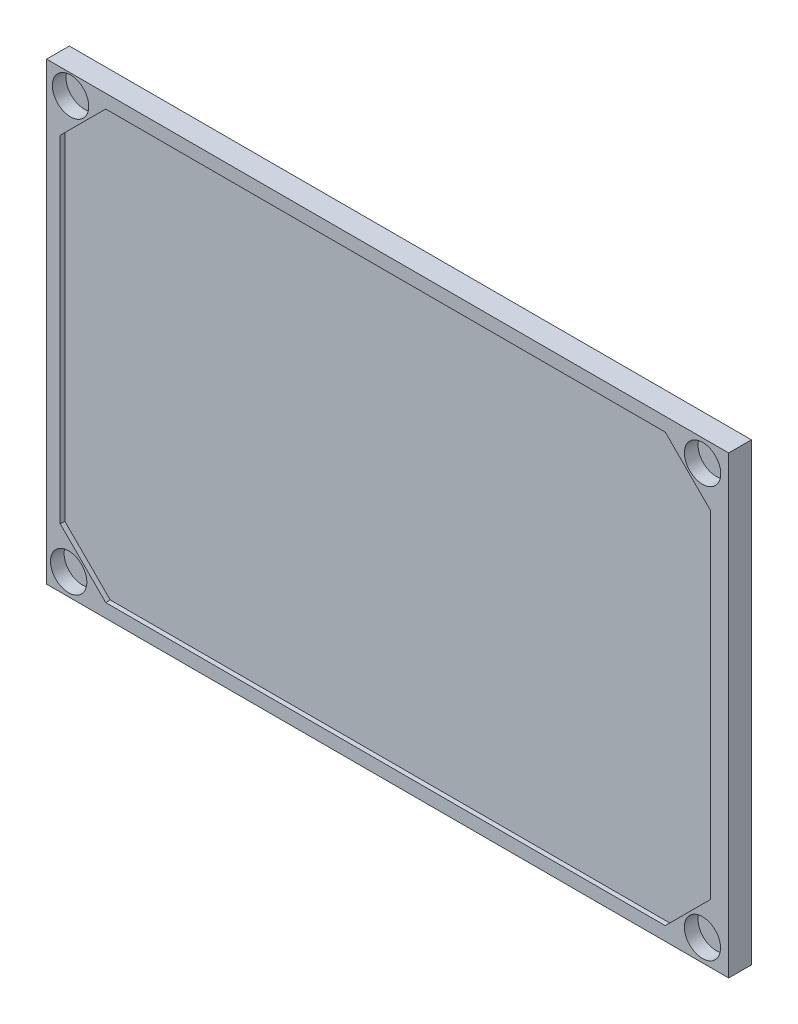
ISO-10303-21;
HEADER;
FILE_DESCRIPTION(('STEP AP214'),'2;1');
FILE_NAME('part.step','',(''),(''),'','','');
FILE_SCHEMA(('AUTOMOTIVE_DESIGN { 1 0 10303 214 1 1 1 1 }'));
ENDSEC;
DATA;
#1=APPLICATION_CONTEXT('core data for automotive mechanical design processes');
#2=APPLICATION_PROTOCOL_DEFINITION('international standard','automotive_design',2000,#1);
#3=PRODUCT_CONTEXT('',#1,'mechanical');
#4=PRODUCT('Part','Part','',(#3));
#5=PRODUCT_RELATED_PRODUCT_CATEGORY('part','',(#4));
#6=PRODUCT_DEFINITION_FORMATION('','',#4);
#7=PRODUCT_DEFINITION_CONTEXT('part definition',#1,'design');
#8=PRODUCT_DEFINITION('design','',#6,#7);
#9=PRODUCT_DEFINITION_SHAPE('','',#8);
#10=(LENGTH_UNIT() NAMED_UNIT(*) SI_UNIT(.MILLI.,.METRE.));
#11=(NAMED_UNIT(*) PLANE_ANGLE_UNIT() SI_UNIT($,.RADIAN.));
#12=(NAMED_UNIT(*) SI_UNIT($,.STERADIAN.) SOLID_ANGLE_UNIT());
#13=UNCERTAINTY_MEASURE_WITH_UNIT(LENGTH_MEASURE(1.E-05),#10,'distance_accuracy_value','');
#14=(GEOMETRIC_REPRESENTATION_CONTEXT(3) GLOBAL_UNCERTAINTY_ASSIGNED_CONTEXT((#13)) GLOBAL_UNIT_ASSIGNED_CONTEXT((#10,
#11,#12)) REPRESENTATION_CONTEXT('',''));
#15=CARTESIAN_POINT('',(0.,0.,0.));
#16=DIRECTION('',(0.,0.,1.));
#17=DIRECTION('',(1.,0.,0.));
#18=AXIS2_PLACEMENT_3D('',#15,#16,#17);
#19=CARTESIAN_POINT('',(-96.1737310095714,39.2273402674591,4.99999999999999));
#20=DIRECTION('',(1.,0.,0.));
#21=DIRECTION('',(0.,1.,0.));
#22=AXIS2_PLACEMENT_3D('',#19,#20,#21);
#23=PLANE('',#22);
#24=DIRECTION('',(0.,-1.,0.));
#25=VECTOR('',#24,1.);
#26=CARTESIAN_POINT('',(-96.1737310095714,39.2273402674591,0.));
#27=LINE('',#26,#25);
#28=CARTESIAN_POINT('',(-96.1737310095714,39.2273402674591,0.));
#29=VERTEX_POINT('',#28);
#30=CARTESIAN_POINT('',(-96.1737310095713,-60.7726597325409,0.));
#31=VERTEX_POINT('',#30);
#32=EDGE_CURVE('E202',#29,#31,#27,.T.);
#33=ORIENTED_EDGE('',*,*,#32,.T.);
#34=DIRECTION('',(0.,0.,-1.));
#35=VECTOR('',#34,1.);
#36=CARTESIAN_POINT('',(-96.1737310095713,-60.7726597325409,4.99999999999999));
#37=LINE('',#36,#35);
#38=CARTESIAN_POINT('',(-96.1737310095713,-60.7726597325409,4.99999999999999));
#39=VERTEX_POINT('',#38);
#40=EDGE_CURVE('E11',#39,#31,#37,.T.);
#41=ORIENTED_EDGE('',*,*,#40,.F.);
#42=DIRECTION('',(0.,-1.,0.));
#43=VECTOR('',#42,1.);
#44=CARTESIAN_POINT('',(-96.1737310095714,39.2273402674591,4.99999999999999));
#45=LINE('',#44,#43);
#46=CARTESIAN_POINT('',(-96.1737310095714,39.2273402674591,4.99999999999999));
#47=VERTEX_POINT('',#46);
#48=EDGE_CURVE('E214',#47,#39,#45,.T.);
#49=ORIENTED_EDGE('',*,*,#48,.F.);
#50=DIRECTION('',(0.,0.,-1.));
#51=VECTOR('',#50,1.);
#52=CARTESIAN_POINT('',(-96.1737310095714,39.2273402674591,4.99999999999999));
#53=LINE('',#52,#51);
#54=EDGE_CURVE('E220',#47,#29,#53,.T.);
#55=ORIENTED_EDGE('',*,*,#54,.T.);
#56=EDGE_LOOP('',(#33,#41,#49,#55));
#57=FACE_BOUND('',#56,.T.);
#58=ADVANCED_FACE('F42',(#57),#23,.F.);
#59=CARTESIAN_POINT('',(-96.1737310095713,-60.7726597325409,4.99999999999999));
#60=DIRECTION('',(0.,1.,0.));
#61=DIRECTION('',(0.,0.,1.));
#62=AXIS2_PLACEMENT_3D('',#59,#60,#61);
#63=PLANE('',#62);
#64=DIRECTION('',(1.,0.,0.));
#65=VECTOR('',#64,1.);
#66=CARTESIAN_POINT('',(-96.1737310095713,-60.7726597325409,0.));
#67=LINE('',#66,#65);
#68=CARTESIAN_POINT('',(53.8262689904287,-60.7726597325409,0.));
#69=VERTEX_POINT('',#68);
#70=EDGE_CURVE('E223',#31,#69,#67,.T.);
#71=ORIENTED_EDGE('',*,*,#70,.T.);
#72=DIRECTION('',(0.,0.,-1.));
#73=VECTOR('',#72,1.);
#74=CARTESIAN_POINT('',(53.8262689904287,-60.7726597325409,4.99999999999999));
#75=LINE('',#74,#73);
#76=CARTESIAN_POINT('',(53.8262689904287,-60.7726597325409,4.99999999999999));
#77=VERTEX_POINT('',#76);
#78=EDGE_CURVE('E49',#77,#69,#75,.T.);
#79=ORIENTED_EDGE('',*,*,#78,.F.);
#80=DIRECTION('',(1.,0.,0.));
#81=VECTOR('',#80,1.);
#82=CARTESIAN_POINT('',(-96.1737310095713,-60.7726597325409,4.99999999999999));
#83=LINE('',#82,#81);
#84=EDGE_CURVE('E93',#39,#77,#83,.T.);
#85=ORIENTED_EDGE('',*,*,#84,.F.);
#86=ORIENTED_EDGE('',*,*,#40,.T.);
#87=EDGE_LOOP('',(#71,#79,#85,#86));
#88=FACE_BOUND('',#87,.T.);
#89=ADVANCED_FACE('F252',(#88),#63,.F.);
#90=CARTESIAN_POINT('',(53.8262689904286,39.2273402674591,4.99999999999999));
#91=DIRECTION('',(-1.,0.,0.));
#92=DIRECTION('',(0.,-1.,0.));
#93=AXIS2_PLACEMENT_3D('',#90,#91,#92);
#94=PLANE('',#93);
#95=DIRECTION('',(0.,1.,0.));
#96=VECTOR('',#95,1.);
#97=CARTESIAN_POINT('',(53.8262689904286,39.2273402674591,0.));
#98=LINE('',#97,#96);
#99=CARTESIAN_POINT('',(53.8262689904286,39.2273402674591,0.));
#100=VERTEX_POINT('',#99);
#101=EDGE_CURVE('E225',#69,#100,#98,.T.);
#102=ORIENTED_EDGE('',*,*,#101,.T.);
#103=DIRECTION('',(0.,0.,-1.));
#104=VECTOR('',#103,1.);
#105=CARTESIAN_POINT('',(53.8262689904286,39.2273402674591,4.99999999999999));
#106=LINE('',#105,#104);
#107=CARTESIAN_POINT('',(53.8262689904286,39.2273402674591,4.99999999999999));
#108=VERTEX_POINT('',#107);
#109=EDGE_CURVE('E229',#108,#100,#106,.T.);
#110=ORIENTED_EDGE('',*,*,#109,.F.);
#111=DIRECTION('',(0.,1.,0.));
#112=VECTOR('',#111,1.);
#113=CARTESIAN_POINT('',(53.8262689904286,39.2273402674591,4.99999999999999));
#114=LINE('',#113,#112);
#115=EDGE_CURVE('E217',#77,#108,#114,.T.);
#116=ORIENTED_EDGE('',*,*,#115,.F.);
#117=ORIENTED_EDGE('',*,*,#78,.T.);
#118=EDGE_LOOP('',(#102,#110,#116,#117));
#119=FACE_BOUND('',#118,.T.);
#120=ADVANCED_FACE('F234',(#119),#94,.F.);
#121=CARTESIAN_POINT('',(-96.1737310095714,39.2273402674591,4.99999999999999));
#122=DIRECTION('',(0.,-1.,0.));
#123=DIRECTION('',(0.,0.,-1.));
#124=AXIS2_PLACEMENT_3D('',#121,#122,#123);
#125=PLANE('',#124);
#126=DIRECTION('',(-1.,0.,0.));
#127=VECTOR('',#126,1.);
#128=CARTESIAN_POINT('',(-96.1737310095714,39.2273402674591,0.));
#129=LINE('',#128,#127);
#130=EDGE_CURVE('E86',#100,#29,#129,.T.);
#131=ORIENTED_EDGE('',*,*,#130,.T.);
#132=ORIENTED_EDGE('',*,*,#54,.F.);
#133=DIRECTION('',(-1.,0.,0.));
#134=VECTOR('',#133,1.);
#135=CARTESIAN_POINT('',(-96.1737310095714,39.2273402674591,4.99999999999999));
#136=LINE('',#135,#134);
#137=EDGE_CURVE('E65',#108,#47,#136,.T.);
#138=ORIENTED_EDGE('',*,*,#137,.F.);
#139=ORIENTED_EDGE('',*,*,#109,.T.);
#140=EDGE_LOOP('',(#131,#132,#138,#139));
#141=FACE_BOUND('',#140,.T.);
#142=ADVANCED_FACE('F242',(#141),#125,.F.);
#143=CARTESIAN_POINT('',(0.,0.,4.99999999999999));
#144=DIRECTION('',(0.,0.,1.));
#145=DIRECTION('',(1.,0.,0.));
#146=AXIS2_PLACEMENT_3D('',#143,#144,#145);
#147=PLANE('',#146);
#148=CARTESIAN_POINT('',(48.0630864837965,-55.9471856739253,4.99999999999999));
#149=DIRECTION('',(0.,0.,1.));
#150=DIRECTION('',(1.,0.,0.));
#151=AXIS2_PLACEMENT_3D('',#148,#149,#150);
#152=CIRCLE('',#151,3.98220429856953);
#153=CARTESIAN_POINT('',(52.045290782366,-55.9471856739253,4.99999999999999));
#154=VERTEX_POINT('',#153);
#155=EDGE_CURVE('E542',#154,#154,#152,.T.);
#156=ORIENTED_EDGE('',*,*,#155,.F.);
#157=EDGE_LOOP('',(#156));
#158=FACE_BOUND('',#157,.T.);
#159=CARTESIAN_POINT('',(-91.3230211241603,-55.9869827447535,4.99999999999999));
#160=DIRECTION('',(0.,0.,1.));
#161=DIRECTION('',(1.,0.,0.));
#162=AXIS2_PLACEMENT_3D('',#159,#160,#161);
#163=CIRCLE('',#162,4.00000000000001);
#164=CARTESIAN_POINT('',(-87.3230211241603,-55.9869827447535,4.99999999999999));
#165=VERTEX_POINT('',#164);
#166=EDGE_CURVE('E541',#165,#165,#163,.T.);
#167=ORIENTED_EDGE('',*,*,#166,.F.);
#168=EDGE_LOOP('',(#167));
#169=FACE_BOUND('',#168,.T.);
#170=CARTESIAN_POINT('',(48.0832777286675,34.3814469796302,4.99999999999999));
#171=DIRECTION('',(0.,0.,1.));
#172=DIRECTION('',(1.,0.,0.));
#173=AXIS2_PLACEMENT_3D('',#170,#171,#172);
#174=CIRCLE('',#173,4.00000000000001);
#175=CARTESIAN_POINT('',(52.0832777286675,34.3814469796302,4.99999999999999));
#176=VERTEX_POINT('',#175);
#177=EDGE_CURVE('E551',#176,#176,#174,.T.);
#178=ORIENTED_EDGE('',*,*,#177,.F.);
#179=EDGE_LOOP('',(#178));
#180=FACE_BOUND('',#179,.T.);
#181=CARTESIAN_POINT('',(-90.907387200853,34.8576410337563,4.99999999999999));
#182=DIRECTION('',(0.,0.,1.));
#183=DIRECTION('',(1.,0.,0.));
#184=AXIS2_PLACEMENT_3D('',#181,#182,#183);
#185=CIRCLE('',#184,4.00000000000001);
#186=CARTESIAN_POINT('',(-86.907387200853,34.8576410337563,4.99999999999999));
#187=VERTEX_POINT('',#186);
#188=EDGE_CURVE('E166',#187,#187,#185,.T.);
#189=ORIENTED_EDGE('',*,*,#188,.F.);
#190=EDGE_LOOP('',(#189));
#191=FACE_BOUND('',#190,.T.);
#192=DIRECTION('',(-0.707106781186547,-0.707106781186548,0.));
#193=VECTOR('',#192,1.);
#194=CARTESIAN_POINT('',(-83.1737310095714,36.2273402674591,4.99999999999999));
#195=LINE('',#194,#193);
#196=CARTESIAN_POINT('',(-83.1737310095714,36.2273402674591,4.99999999999999));
#197=VERTEX_POINT('',#196);
#198=CARTESIAN_POINT('',(-93.1737310095714,26.2273402674591,4.99999999999999));
#199=VERTEX_POINT('',#198);
#200=EDGE_CURVE('E56',#197,#199,#195,.T.);
#201=ORIENTED_EDGE('',*,*,#200,.F.);
#202=DIRECTION('',(-1.,0.,0.));
#203=VECTOR('',#202,1.);
#204=CARTESIAN_POINT('',(-83.1737310095714,36.2273402674591,4.99999999999999));
#205=LINE('',#204,#203);
#206=CARTESIAN_POINT('',(39.8736654704286,36.2273402674591,4.99999999999999));
#207=VERTEX_POINT('',#206);
#208=EDGE_CURVE('E160',#207,#197,#205,.T.);
#209=ORIENTED_EDGE('',*,*,#208,.F.);
#210=DIRECTION('',(-0.707106781186548,0.707106781186548,0.));
#211=VECTOR('',#210,1.);
#212=CARTESIAN_POINT('',(39.8736654704286,36.2273402674591,4.99999999999999));
#213=LINE('',#212,#211);
#214=CARTESIAN_POINT('',(49.8736654704287,26.2273402674591,4.99999999999999));
#215=VERTEX_POINT('',#214);
#216=EDGE_CURVE('E163',#215,#207,#213,.T.);
#217=ORIENTED_EDGE('',*,*,#216,.F.);
#218=DIRECTION('',(0.,1.,0.));
#219=VECTOR('',#218,1.);
#220=CARTESIAN_POINT('',(49.8736654704287,26.2273402674591,4.99999999999999));
#221=LINE('',#220,#219);
#222=CARTESIAN_POINT('',(49.8736654704286,-47.7726597325409,4.99999999999999));
#223=VERTEX_POINT('',#222);
#224=EDGE_CURVE('E195',#223,#215,#221,.T.);
#225=ORIENTED_EDGE('',*,*,#224,.F.);
#226=DIRECTION('',(0.707106781186548,0.707106781186548,0.));
#227=VECTOR('',#226,1.);
#228=CARTESIAN_POINT('',(49.8736654704286,-47.7726597325409,4.99999999999999));
#229=LINE('',#228,#227);
#230=CARTESIAN_POINT('',(39.8736654704286,-57.7726597325409,4.99999999999999));
#231=VERTEX_POINT('',#230);
#232=EDGE_CURVE('E192',#231,#223,#229,.T.);
#233=ORIENTED_EDGE('',*,*,#232,.F.);
#234=DIRECTION('',(1.,0.,0.));
#235=VECTOR('',#234,1.);
#236=CARTESIAN_POINT('',(-83.1737310095713,-57.7726597325409,4.99999999999999));
#237=LINE('',#236,#235);
#238=CARTESIAN_POINT('',(-83.1737310095713,-57.7726597325409,4.99999999999999));
#239=VERTEX_POINT('',#238);
#240=EDGE_CURVE('E189',#239,#231,#237,.T.);
#241=ORIENTED_EDGE('',*,*,#240,.F.);
#242=DIRECTION('',(0.707106781186547,-0.707106781186548,0.));
#243=VECTOR('',#242,1.);
#244=CARTESIAN_POINT('',(-93.1737310095713,-47.7726597325409,4.99999999999999));
#245=LINE('',#244,#243);
#246=CARTESIAN_POINT('',(-93.1737310095713,-47.7726597325409,4.99999999999999));
#247=VERTEX_POINT('',#246);
#248=EDGE_CURVE('E186',#247,#239,#245,.T.);
#249=ORIENTED_EDGE('',*,*,#248,.F.);
#250=DIRECTION('',(0.,-1.,0.));
#251=VECTOR('',#250,1.);
#252=CARTESIAN_POINT('',(-93.1737310095714,26.2273402674591,4.99999999999999));
#253=LINE('',#252,#251);
#254=EDGE_CURVE('E183',#199,#247,#253,.T.);
#255=ORIENTED_EDGE('',*,*,#254,.F.);
#256=EDGE_LOOP('',(#201,#209,#217,#225,#233,#241,#249,#255));
#257=FACE_BOUND('',#256,.T.);
#258=ORIENTED_EDGE('',*,*,#48,.T.);
#259=ORIENTED_EDGE('',*,*,#84,.T.);
#260=ORIENTED_EDGE('',*,*,#115,.T.);
#261=ORIENTED_EDGE('',*,*,#137,.T.);
#262=EDGE_LOOP('',(#258,#259,#260,#261));
#263=FACE_BOUND('',#262,.T.);
#264=ADVANCED_FACE('F244',(#158,#169,#180,#191,#257,#263),#147,.T.);
#265=CARTESIAN_POINT('',(0.,0.,0.));
#266=DIRECTION('',(0.,0.,1.));
#267=DIRECTION('',(1.,0.,0.));
#268=AXIS2_PLACEMENT_3D('',#265,#266,#267);
#269=PLANE('',#268);
#270=ORIENTED_EDGE('',*,*,#32,.F.);
#271=ORIENTED_EDGE('',*,*,#130,.F.);
#272=ORIENTED_EDGE('',*,*,#101,.F.);
#273=ORIENTED_EDGE('',*,*,#70,.F.);
#274=EDGE_LOOP('',(#270,#271,#272,#273));
#275=FACE_BOUND('',#274,.T.);
#276=ADVANCED_FACE('F238',(#275),#269,.F.);
#277=CARTESIAN_POINT('',(-83.1737310095714,36.2273402674591,4.00000000000002));
#278=DIRECTION('',(-0.707106781186548,0.707106781186547,0.));
#279=DIRECTION('',(-0.707106781186547,-0.707106781186548,0.));
#280=AXIS2_PLACEMENT_3D('',#277,#278,#279);
#281=PLANE('',#280);
#282=ORIENTED_EDGE('',*,*,#200,.T.);
#283=DIRECTION('',(0.,0.,1.));
#284=VECTOR('',#283,1.);
#285=CARTESIAN_POINT('',(-93.1737310095714,26.2273402674591,4.00000000000002));
#286=LINE('',#285,#284);
#287=CARTESIAN_POINT('',(-93.1737310095714,26.2273402674591,4.00000000000002));
#288=VERTEX_POINT('',#287);
#289=EDGE_CURVE('E137',#288,#199,#286,.T.);
#290=ORIENTED_EDGE('',*,*,#289,.F.);
#291=DIRECTION('',(-0.707106781186547,-0.707106781186548,0.));
#292=VECTOR('',#291,1.);
#293=CARTESIAN_POINT('',(-83.1737310095714,36.2273402674591,4.00000000000002));
#294=LINE('',#293,#292);
#295=CARTESIAN_POINT('',(-83.1737310095714,36.2273402674591,4.00000000000002));
#296=VERTEX_POINT('',#295);
#297=EDGE_CURVE('E141',#296,#288,#294,.T.);
#298=ORIENTED_EDGE('',*,*,#297,.F.);
#299=DIRECTION('',(0.,0.,1.));
#300=VECTOR('',#299,1.);
#301=CARTESIAN_POINT('',(-83.1737310095714,36.2273402674591,4.00000000000002));
#302=LINE('',#301,#300);
#303=EDGE_CURVE('E200',#296,#197,#302,.T.);
#304=ORIENTED_EDGE('',*,*,#303,.T.);
#305=EDGE_LOOP('',(#282,#290,#298,#304));
#306=FACE_BOUND('',#305,.T.);
#307=ADVANCED_FACE('F139',(#306),#281,.F.);
#308=CARTESIAN_POINT('',(-83.1737310095714,36.2273402674591,4.00000000000002));
#309=DIRECTION('',(0.,1.,0.));
#310=DIRECTION('',(0.,0.,1.));
#311=AXIS2_PLACEMENT_3D('',#308,#309,#310);
#312=PLANE('',#311);
#313=ORIENTED_EDGE('',*,*,#208,.T.);
#314=ORIENTED_EDGE('',*,*,#303,.F.);
#315=DIRECTION('',(-1.,0.,0.));
#316=VECTOR('',#315,1.);
#317=CARTESIAN_POINT('',(-83.1737310095714,36.2273402674591,4.00000000000002));
#318=LINE('',#317,#316);
#319=CARTESIAN_POINT('',(39.8736654704286,36.2273402674591,4.00000000000002));
#320=VERTEX_POINT('',#319);
#321=EDGE_CURVE('E147',#320,#296,#318,.T.);
#322=ORIENTED_EDGE('',*,*,#321,.F.);
#323=DIRECTION('',(0.,0.,1.));
#324=VECTOR('',#323,1.);
#325=CARTESIAN_POINT('',(39.8736654704286,36.2273402674591,4.00000000000002));
#326=LINE('',#325,#324);
#327=EDGE_CURVE('E203',#320,#207,#326,.T.);
#328=ORIENTED_EDGE('',*,*,#327,.T.);
#329=EDGE_LOOP('',(#313,#314,#322,#328));
#330=FACE_BOUND('',#329,.T.);
#331=ADVANCED_FACE('F285',(#330),#312,.F.);
#332=CARTESIAN_POINT('',(39.8736654704286,36.2273402674591,4.00000000000002));
#333=DIRECTION('',(0.707106781186548,0.707106781186548,0.));
#334=DIRECTION('',(-0.707106781186548,0.707106781186548,0.));
#335=AXIS2_PLACEMENT_3D('',#332,#333,#334);
#336=PLANE('',#335);
#337=ORIENTED_EDGE('',*,*,#216,.T.);
#338=ORIENTED_EDGE('',*,*,#327,.F.);
#339=DIRECTION('',(-0.707106781186548,0.707106781186548,0.));
#340=VECTOR('',#339,1.);
#341=CARTESIAN_POINT('',(39.8736654704286,36.2273402674591,4.00000000000002));
#342=LINE('',#341,#340);
#343=CARTESIAN_POINT('',(49.8736654704287,26.2273402674591,4.00000000000002));
#344=VERTEX_POINT('',#343);
#345=EDGE_CURVE('E179',#344,#320,#342,.T.);
#346=ORIENTED_EDGE('',*,*,#345,.F.);
#347=DIRECTION('',(0.,0.,1.));
#348=VECTOR('',#347,1.);
#349=CARTESIAN_POINT('',(49.8736654704287,26.2273402674591,4.00000000000002));
#350=LINE('',#349,#348);
#351=EDGE_CURVE('E205',#344,#215,#350,.T.);
#352=ORIENTED_EDGE('',*,*,#351,.T.);
#353=EDGE_LOOP('',(#337,#338,#346,#352));
#354=FACE_BOUND('',#353,.T.);
#355=ADVANCED_FACE('F290',(#354),#336,.F.);
#356=CARTESIAN_POINT('',(49.8736654704287,26.2273402674591,4.00000000000002));
#357=DIRECTION('',(1.,0.,0.));
#358=DIRECTION('',(0.,1.,0.));
#359=AXIS2_PLACEMENT_3D('',#356,#357,#358);
#360=PLANE('',#359);
#361=ORIENTED_EDGE('',*,*,#224,.T.);
#362=ORIENTED_EDGE('',*,*,#351,.F.);
#363=DIRECTION('',(0.,1.,0.));
#364=VECTOR('',#363,1.);
#365=CARTESIAN_POINT('',(49.8736654704287,26.2273402674591,4.00000000000002));
#366=LINE('',#365,#364);
#367=CARTESIAN_POINT('',(49.8736654704286,-47.7726597325409,4.00000000000002));
#368=VERTEX_POINT('',#367);
#369=EDGE_CURVE('E176',#368,#344,#366,.T.);
#370=ORIENTED_EDGE('',*,*,#369,.F.);
#371=DIRECTION('',(0.,0.,1.));
#372=VECTOR('',#371,1.);
#373=CARTESIAN_POINT('',(49.8736654704286,-47.7726597325409,4.00000000000002));
#374=LINE('',#373,#372);
#375=EDGE_CURVE('E207',#368,#223,#374,.T.);
#376=ORIENTED_EDGE('',*,*,#375,.T.);
#377=EDGE_LOOP('',(#361,#362,#370,#376));
#378=FACE_BOUND('',#377,.T.);
#379=ADVANCED_FACE('F300',(#378),#360,.F.);
#380=CARTESIAN_POINT('',(49.8736654704286,-47.7726597325409,4.00000000000002));
#381=DIRECTION('',(0.707106781186548,-0.707106781186548,0.));
#382=DIRECTION('',(0.707106781186548,0.707106781186548,0.));
#383=AXIS2_PLACEMENT_3D('',#380,#381,#382);
#384=PLANE('',#383);
#385=ORIENTED_EDGE('',*,*,#232,.T.);
#386=ORIENTED_EDGE('',*,*,#375,.F.);
#387=DIRECTION('',(0.707106781186548,0.707106781186548,0.));
#388=VECTOR('',#387,1.);
#389=CARTESIAN_POINT('',(49.8736654704286,-47.7726597325409,4.00000000000002));
#390=LINE('',#389,#388);
#391=CARTESIAN_POINT('',(39.8736654704286,-57.7726597325409,4.00000000000002));
#392=VERTEX_POINT('',#391);
#393=EDGE_CURVE('E173',#392,#368,#390,.T.);
#394=ORIENTED_EDGE('',*,*,#393,.F.);
#395=DIRECTION('',(0.,0.,1.));
#396=VECTOR('',#395,1.);
#397=CARTESIAN_POINT('',(39.8736654704286,-57.7726597325409,4.00000000000002));
#398=LINE('',#397,#396);
#399=EDGE_CURVE('E209',#392,#231,#398,.T.);
#400=ORIENTED_EDGE('',*,*,#399,.T.);
#401=EDGE_LOOP('',(#385,#386,#394,#400));
#402=FACE_BOUND('',#401,.T.);
#403=ADVANCED_FACE('F305',(#402),#384,.F.);
#404=CARTESIAN_POINT('',(-83.1737310095713,-57.7726597325409,4.00000000000002));
#405=DIRECTION('',(0.,-1.,0.));
#406=DIRECTION('',(1.,0.,0.));
#407=AXIS2_PLACEMENT_3D('',#404,#405,#406);
#408=PLANE('',#407);
#409=ORIENTED_EDGE('',*,*,#240,.T.);
#410=ORIENTED_EDGE('',*,*,#399,.F.);
#411=DIRECTION('',(1.,0.,0.));
#412=VECTOR('',#411,1.);
#413=CARTESIAN_POINT('',(-83.1737310095713,-57.7726597325409,4.00000000000002));
#414=LINE('',#413,#412);
#415=CARTESIAN_POINT('',(-83.1737310095713,-57.7726597325409,4.00000000000002));
#416=VERTEX_POINT('',#415);
#417=EDGE_CURVE('E170',#416,#392,#414,.T.);
#418=ORIENTED_EDGE('',*,*,#417,.F.);
#419=DIRECTION('',(0.,0.,1.));
#420=VECTOR('',#419,1.);
#421=CARTESIAN_POINT('',(-83.1737310095713,-57.7726597325409,4.00000000000002));
#422=LINE('',#421,#420);
#423=EDGE_CURVE('E211',#416,#239,#422,.T.);
#424=ORIENTED_EDGE('',*,*,#423,.T.);
#425=EDGE_LOOP('',(#409,#410,#418,#424));
#426=FACE_BOUND('',#425,.T.);
#427=ADVANCED_FACE('F313',(#426),#408,.F.);
#428=CARTESIAN_POINT('',(-93.1737310095713,-47.7726597325409,4.00000000000002));
#429=DIRECTION('',(-0.707106781186548,-0.707106781186547,0.));
#430=DIRECTION('',(0.707106781186547,-0.707106781186548,0.));
#431=AXIS2_PLACEMENT_3D('',#428,#429,#430);
#432=PLANE('',#431);
#433=ORIENTED_EDGE('',*,*,#248,.T.);
#434=ORIENTED_EDGE('',*,*,#423,.F.);
#435=DIRECTION('',(0.707106781186547,-0.707106781186548,0.));
#436=VECTOR('',#435,1.);
#437=CARTESIAN_POINT('',(-93.1737310095713,-47.7726597325409,4.00000000000002));
#438=LINE('',#437,#436);
#439=CARTESIAN_POINT('',(-93.1737310095713,-47.7726597325409,4.00000000000002));
#440=VERTEX_POINT('',#439);
#441=EDGE_CURVE('E155',#440,#416,#438,.T.);
#442=ORIENTED_EDGE('',*,*,#441,.F.);
#443=DIRECTION('',(0.,0.,1.));
#444=VECTOR('',#443,1.);
#445=CARTESIAN_POINT('',(-93.1737310095713,-47.7726597325409,4.00000000000002));
#446=LINE('',#445,#444);
#447=EDGE_CURVE('E146',#440,#247,#446,.T.);
#448=ORIENTED_EDGE('',*,*,#447,.T.);
#449=EDGE_LOOP('',(#433,#434,#442,#448));
#450=FACE_BOUND('',#449,.T.);
#451=ADVANCED_FACE('F276',(#450),#432,.F.);
#452=CARTESIAN_POINT('',(-93.1737310095714,26.2273402674591,4.00000000000002));
#453=DIRECTION('',(-1.,0.,0.));
#454=DIRECTION('',(0.,-1.,0.));
#455=AXIS2_PLACEMENT_3D('',#452,#453,#454);
#456=PLANE('',#455);
#457=ORIENTED_EDGE('',*,*,#254,.T.);
#458=ORIENTED_EDGE('',*,*,#447,.F.);
#459=DIRECTION('',(0.,-1.,0.));
#460=VECTOR('',#459,1.);
#461=CARTESIAN_POINT('',(-93.1737310095714,26.2273402674591,4.00000000000002));
#462=LINE('',#461,#460);
#463=EDGE_CURVE('E150',#288,#440,#462,.T.);
#464=ORIENTED_EDGE('',*,*,#463,.F.);
#465=ORIENTED_EDGE('',*,*,#289,.T.);
#466=EDGE_LOOP('',(#457,#458,#464,#465));
#467=FACE_BOUND('',#466,.T.);
#468=ADVANCED_FACE('F151',(#467),#456,.F.);
#469=CARTESIAN_POINT('',(0.,0.,4.00000000000002));
#470=DIRECTION('',(0.,0.,1.));
#471=DIRECTION('',(1.,0.,0.));
#472=AXIS2_PLACEMENT_3D('',#469,#470,#471);
#473=PLANE('',#472);
#474=ORIENTED_EDGE('',*,*,#297,.T.);
#475=ORIENTED_EDGE('',*,*,#463,.T.);
#476=ORIENTED_EDGE('',*,*,#441,.T.);
#477=ORIENTED_EDGE('',*,*,#417,.T.);
#478=ORIENTED_EDGE('',*,*,#393,.T.);
#479=ORIENTED_EDGE('',*,*,#369,.T.);
#480=ORIENTED_EDGE('',*,*,#345,.T.);
#481=ORIENTED_EDGE('',*,*,#321,.T.);
#482=EDGE_LOOP('',(#474,#475,#476,#477,#478,#479,#480,#481));
#483=FACE_BOUND('',#482,.T.);
#484=ADVANCED_FACE('F157',(#483),#473,.T.);
#485=CARTESIAN_POINT('',(-90.907387200853,34.8576410337563,1.99999999999999));
#486=DIRECTION('',(0.,0.,1.));
#487=DIRECTION('',(1.,0.,0.));
#488=AXIS2_PLACEMENT_3D('',#485,#486,#487);
#489=CYLINDRICAL_SURFACE('',#488,4.00000000000001);
#490=CARTESIAN_POINT('',(-90.907387200853,34.8576410337563,1.99999999999999));
#491=DIRECTION('',(0.,0.,1.));
#492=DIRECTION('',(1.,0.,0.));
#493=AXIS2_PLACEMENT_3D('',#490,#491,#492);
#494=CIRCLE('',#493,4.00000000000001);
#495=CARTESIAN_POINT('',(-86.907387200853,34.8576410337563,1.99999999999999));
#496=VERTEX_POINT('',#495);
#497=EDGE_CURVE('E184',#496,#496,#494,.T.);
#498=ORIENTED_EDGE('',*,*,#497,.F.);
#499=EDGE_LOOP('',(#498));
#500=FACE_BOUND('',#499,.T.);
#501=ORIENTED_EDGE('',*,*,#188,.T.);
#502=EDGE_LOOP('',(#501));
#503=FACE_BOUND('',#502,.T.);
#504=ADVANCED_FACE('F354',(#500,#503),#489,.F.);
#505=CARTESIAN_POINT('',(-90.907387200853,34.8576410337563,1.99999999999999));
#506=DIRECTION('',(0.,0.,1.));
#507=DIRECTION('',(1.,0.,0.));
#508=AXIS2_PLACEMENT_3D('',#505,#506,#507);
#509=PLANE('',#508);
#510=ORIENTED_EDGE('',*,*,#497,.T.);
#511=EDGE_LOOP('',(#510));
#512=FACE_BOUND('',#511,.T.);
#513=ADVANCED_FACE('F361',(#512),#509,.T.);
#514=CARTESIAN_POINT('',(48.0832777286675,34.3814469796302,1.99999999999999));
#515=DIRECTION('',(0.,0.,1.));
#516=DIRECTION('',(1.,0.,0.));
#517=AXIS2_PLACEMENT_3D('',#514,#515,#516);
#518=CYLINDRICAL_SURFACE('',#517,4.00000000000001);
#519=CARTESIAN_POINT('',(48.0832777286675,34.3814469796302,1.99999999999999));
#520=DIRECTION('',(0.,0.,1.));
#521=DIRECTION('',(1.,0.,0.));
#522=AXIS2_PLACEMENT_3D('',#519,#520,#521);
#523=CIRCLE('',#522,4.00000000000001);
#524=CARTESIAN_POINT('',(52.0832777286675,34.3814469796302,1.99999999999999));
#525=VERTEX_POINT('',#524);
#526=EDGE_CURVE('E553',#525,#525,#523,.T.);
#527=ORIENTED_EDGE('',*,*,#526,.F.);
#528=EDGE_LOOP('',(#527));
#529=FACE_BOUND('',#528,.T.);
#530=ORIENTED_EDGE('',*,*,#177,.T.);
#531=EDGE_LOOP('',(#530));
#532=FACE_BOUND('',#531,.T.);
#533=ADVANCED_FACE('F366',(#529,#532),#518,.F.);
#534=CARTESIAN_POINT('',(48.0832777286675,34.3814469796302,1.99999999999999));
#535=DIRECTION('',(0.,0.,1.));
#536=DIRECTION('',(1.,0.,0.));
#537=AXIS2_PLACEMENT_3D('',#534,#535,#536);
#538=PLANE('',#537);
#539=ORIENTED_EDGE('',*,*,#526,.T.);
#540=EDGE_LOOP('',(#539));
#541=FACE_BOUND('',#540,.T.);
#542=ADVANCED_FACE('F381',(#541),#538,.T.);
#543=CARTESIAN_POINT('',(-91.3230211241603,-55.9869827447535,1.99999999999999));
#544=DIRECTION('',(0.,0.,1.));
#545=DIRECTION('',(1.,0.,0.));
#546=AXIS2_PLACEMENT_3D('',#543,#544,#545);
#547=CYLINDRICAL_SURFACE('',#546,4.00000000000001);
#548=CARTESIAN_POINT('',(-91.3230211241603,-55.9869827447535,1.99999999999999));
#549=DIRECTION('',(0.,0.,1.));
#550=DIRECTION('',(1.,0.,0.));
#551=AXIS2_PLACEMENT_3D('',#548,#549,#550);
#552=CIRCLE('',#551,4.00000000000001);
#553=CARTESIAN_POINT('',(-87.3230211241603,-55.9869827447535,1.99999999999999));
#554=VERTEX_POINT('',#553);
#555=EDGE_CURVE('E545',#554,#554,#552,.T.);
#556=ORIENTED_EDGE('',*,*,#555,.F.);
#557=EDGE_LOOP('',(#556));
#558=FACE_BOUND('',#557,.T.);
#559=ORIENTED_EDGE('',*,*,#166,.T.);
#560=EDGE_LOOP('',(#559));
#561=FACE_BOUND('',#560,.T.);
#562=ADVANCED_FACE('F386',(#558,#561),#547,.F.);
#563=CARTESIAN_POINT('',(-91.3230211241603,-55.9869827447535,1.99999999999999));
#564=DIRECTION('',(0.,0.,1.));
#565=DIRECTION('',(1.,0.,0.));
#566=AXIS2_PLACEMENT_3D('',#563,#564,#565);
#567=PLANE('',#566);
#568=ORIENTED_EDGE('',*,*,#555,.T.);
#569=EDGE_LOOP('',(#568));
#570=FACE_BOUND('',#569,.T.);
#571=ADVANCED_FACE('F493',(#570),#567,.T.);
#572=CARTESIAN_POINT('',(48.0630864837965,-55.9471856739253,2.00000000000002));
#573=DIRECTION('',(0.,0.,1.));
#574=DIRECTION('',(1.,0.,0.));
#575=AXIS2_PLACEMENT_3D('',#572,#573,#574);
#576=CYLINDRICAL_SURFACE('',#575,3.98220429856953);
#577=CARTESIAN_POINT('',(48.0630864837965,-55.9471856739253,2.00000000000002));
#578=DIRECTION('',(0.,0.,1.));
#579=DIRECTION('',(1.,0.,0.));
#580=AXIS2_PLACEMENT_3D('',#577,#578,#579);
#581=CIRCLE('',#580,3.98220429856953);
#582=CARTESIAN_POINT('',(52.045290782366,-55.9471856739253,2.00000000000002));
#583=VERTEX_POINT('',#582);
#584=EDGE_CURVE('E540',#583,#583,#581,.T.);
#585=ORIENTED_EDGE('',*,*,#584,.F.);
#586=EDGE_LOOP('',(#585));
#587=FACE_BOUND('',#586,.T.);
#588=ORIENTED_EDGE('',*,*,#155,.T.);
#589=EDGE_LOOP('',(#588));
#590=FACE_BOUND('',#589,.T.);
#591=ADVANCED_FACE('F503',(#587,#590),#576,.F.);
#592=CARTESIAN_POINT('',(48.0630864837965,-55.9471856739253,2.00000000000002));
#593=DIRECTION('',(0.,0.,1.));
#594=DIRECTION('',(1.,0.,0.));
#595=AXIS2_PLACEMENT_3D('',#592,#593,#594);
#596=PLANE('',#595);
#597=ORIENTED_EDGE('',*,*,#584,.T.);
#598=EDGE_LOOP('',(#597));
#599=FACE_BOUND('',#598,.T.);
#600=ADVANCED_FACE('F514',(#599),#596,.T.);
#601=CLOSED_SHELL('',(#58,#89,#120,#142,#264,#276,#307,#331,#355,#379,#403,#427,#451,#468,#484,
#504,#513,#533,#542,#562,#571,#591,#600));
#602=MANIFOLD_SOLID_BREP('B2',#601);
#603=ADVANCED_BREP_SHAPE_REPRESENTATION('',(#18,#602),#14);
#604=SHAPE_DEFINITION_REPRESENTATION(#9,#603);
ENDSEC;
END-ISO-10303-21;
